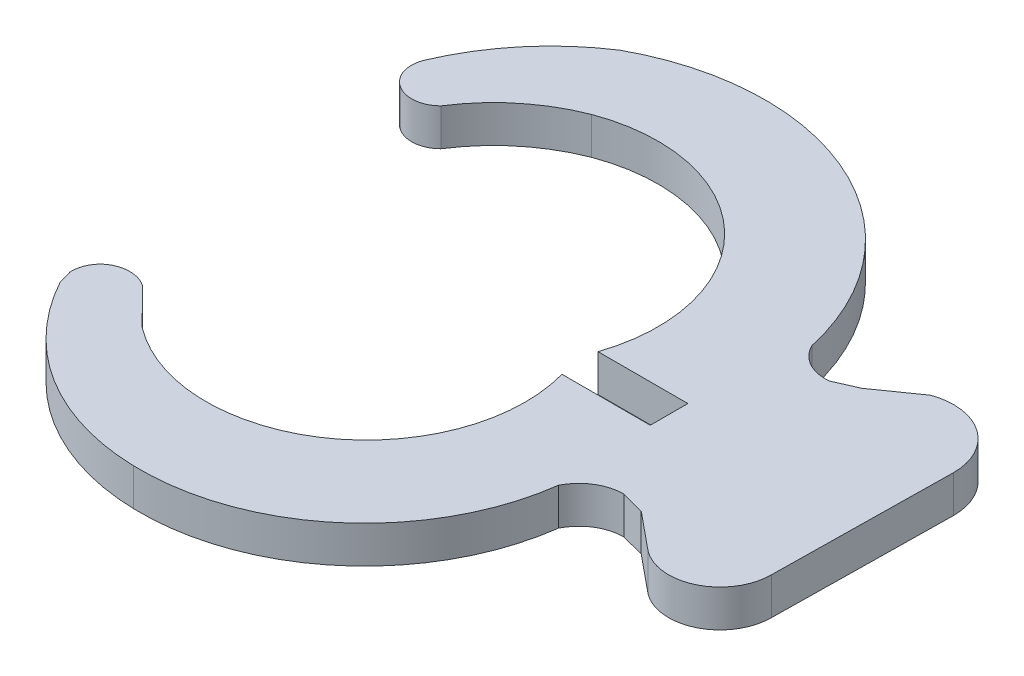
ISO-10303-21;
HEADER;
FILE_DESCRIPTION(('STEP AP214'),'2;1');
FILE_NAME('part.step','',(''),(''),'','','');
FILE_SCHEMA(('AUTOMOTIVE_DESIGN { 1 0 10303 214 1 1 1 1 }'));
ENDSEC;
DATA;
#1=APPLICATION_CONTEXT('core data for automotive mechanical design processes');
#2=APPLICATION_PROTOCOL_DEFINITION('international standard','automotive_design',2000,#1);
#3=PRODUCT_CONTEXT('',#1,'mechanical');
#4=PRODUCT('Part','Part','',(#3));
#5=PRODUCT_RELATED_PRODUCT_CATEGORY('part','',(#4));
#6=PRODUCT_DEFINITION_FORMATION('','',#4);
#7=PRODUCT_DEFINITION_CONTEXT('part definition',#1,'design');
#8=PRODUCT_DEFINITION('design','',#6,#7);
#9=PRODUCT_DEFINITION_SHAPE('','',#8);
#10=(LENGTH_UNIT() NAMED_UNIT(*) SI_UNIT(.MILLI.,.METRE.));
#11=(NAMED_UNIT(*) PLANE_ANGLE_UNIT() SI_UNIT($,.RADIAN.));
#12=(NAMED_UNIT(*) SI_UNIT($,.STERADIAN.) SOLID_ANGLE_UNIT());
#13=UNCERTAINTY_MEASURE_WITH_UNIT(LENGTH_MEASURE(1.E-05),#10,'distance_accuracy_value','');
#14=(GEOMETRIC_REPRESENTATION_CONTEXT(3) GLOBAL_UNCERTAINTY_ASSIGNED_CONTEXT((#13)) GLOBAL_UNIT_ASSIGNED_CONTEXT((#10,
#11,#12)) REPRESENTATION_CONTEXT('',''));
#15=CARTESIAN_POINT('',(0.,0.,0.));
#16=DIRECTION('',(0.,0.,1.));
#17=DIRECTION('',(1.,0.,0.));
#18=AXIS2_PLACEMENT_3D('',#15,#16,#17);
#19=CARTESIAN_POINT('',(-101.420089514844,3.,67.8808404703986));
#20=DIRECTION('',(0.,-1.,0.));
#21=DIRECTION('',(0.,0.,-1.));
#22=AXIS2_PLACEMENT_3D('',#19,#20,#21);
#23=CYLINDRICAL_SURFACE('',#22,12.9818746721);
#24=CARTESIAN_POINT('',(-101.420089514844,0.,67.8808404703986));
#25=DIRECTION('',(0.,-1.,0.));
#26=DIRECTION('',(0.,0.,1.));
#27=AXIS2_PLACEMENT_3D('',#24,#25,#26);
#28=CIRCLE('',#27,12.9818746721);
#29=CARTESIAN_POINT('',(-105.958969999949,0.,55.7182900000392));
#30=VERTEX_POINT('',#29);
#31=CARTESIAN_POINT('',(-89.12274,0.,72.0406799999823));
#32=VERTEX_POINT('',#31);
#33=EDGE_CURVE('E245',#30,#32,#28,.T.);
#34=ORIENTED_EDGE('',*,*,#33,.T.);
#35=DIRECTION('',(0.,-1.,0.));
#36=VECTOR('',#35,1.);
#37=CARTESIAN_POINT('',(-89.12274,3.,72.0406799999823));
#38=LINE('',#37,#36);
#39=CARTESIAN_POINT('',(-89.12274,3.,72.0406799999823));
#40=VERTEX_POINT('',#39);
#41=EDGE_CURVE('E11',#40,#32,#38,.T.);
#42=ORIENTED_EDGE('',*,*,#41,.F.);
#43=CARTESIAN_POINT('',(-101.420089514844,3.,67.8808404703986));
#44=DIRECTION('',(0.,-1.,0.));
#45=DIRECTION('',(0.,0.,1.));
#46=AXIS2_PLACEMENT_3D('',#43,#44,#45);
#47=CIRCLE('',#46,12.9818746721);
#48=CARTESIAN_POINT('',(-105.958969999949,3.,55.7182900000392));
#49=VERTEX_POINT('',#48);
#50=EDGE_CURVE('E297',#49,#40,#47,.T.);
#51=ORIENTED_EDGE('',*,*,#50,.F.);
#52=DIRECTION('',(0.,-1.,0.));
#53=VECTOR('',#52,1.);
#54=CARTESIAN_POINT('',(-105.958969999949,3.,55.7182900000392));
#55=LINE('',#54,#53);
#56=EDGE_CURVE('E241',#49,#30,#55,.T.);
#57=ORIENTED_EDGE('',*,*,#56,.T.);
#58=EDGE_LOOP('',(#34,#42,#51,#57));
#59=FACE_BOUND('',#58,.T.);
#60=ADVANCED_FACE('F35',(#59),#23,.F.);
#61=CARTESIAN_POINT('',(-89.12274,3.,72.0406799999823));
#62=DIRECTION('',(0.,0.,-1.));
#63=DIRECTION('',(-1.,0.,0.));
#64=AXIS2_PLACEMENT_3D('',#61,#62,#63);
#65=PLANE('',#64);
#66=DIRECTION('',(1.,0.,0.));
#67=VECTOR('',#66,1.);
#68=CARTESIAN_POINT('',(-89.12274,0.,72.0406799999823));
#69=LINE('',#68,#67);
#70=CARTESIAN_POINT('',(-81.87171,0.,72.0406799999823));
#71=VERTEX_POINT('',#70);
#72=EDGE_CURVE('E248',#32,#71,#69,.T.);
#73=ORIENTED_EDGE('',*,*,#72,.T.);
#74=DIRECTION('',(0.,-1.,0.));
#75=VECTOR('',#74,1.);
#76=CARTESIAN_POINT('',(-81.87171,3.,72.0406799999823));
#77=LINE('',#76,#75);
#78=CARTESIAN_POINT('',(-81.87171,3.,72.0406799999823));
#79=VERTEX_POINT('',#78);
#80=EDGE_CURVE('E43',#79,#71,#77,.T.);
#81=ORIENTED_EDGE('',*,*,#80,.F.);
#82=DIRECTION('',(1.,0.,0.));
#83=VECTOR('',#82,1.);
#84=CARTESIAN_POINT('',(-89.12274,3.,72.0406799999823));
#85=LINE('',#84,#83);
#86=EDGE_CURVE('E151',#40,#79,#85,.T.);
#87=ORIENTED_EDGE('',*,*,#86,.F.);
#88=ORIENTED_EDGE('',*,*,#41,.T.);
#89=EDGE_LOOP('',(#73,#81,#87,#88));
#90=FACE_BOUND('',#89,.T.);
#91=ADVANCED_FACE('F450',(#90),#65,.F.);
#92=CARTESIAN_POINT('',(-81.87171,3.,72.0406799999823));
#93=DIRECTION('',(0.999999999083245,0.,4.28194993023006E-05));
#94=DIRECTION('',(4.28194993023006E-05,0.,-0.999999999083245));
#95=AXIS2_PLACEMENT_3D('',#92,#93,#94);
#96=PLANE('',#95);
#97=DIRECTION('',(-4.28194993023006E-05,0.,0.999999999083245));
#98=VECTOR('',#97,1.);
#99=CARTESIAN_POINT('',(-81.87171,0.,72.0406799999823));
#100=LINE('',#99,#98);
#101=CARTESIAN_POINT('',(-81.87184,0.,75.0766799999823));
#102=VERTEX_POINT('',#101);
#103=EDGE_CURVE('E250',#71,#102,#100,.T.);
#104=ORIENTED_EDGE('',*,*,#103,.T.);
#105=DIRECTION('',(0.,-1.,0.));
#106=VECTOR('',#105,1.);
#107=CARTESIAN_POINT('',(-81.87184,3.,75.0766799999823));
#108=LINE('',#107,#106);
#109=CARTESIAN_POINT('',(-81.87184,3.,75.0766799999823));
#110=VERTEX_POINT('',#109);
#111=EDGE_CURVE('E361',#110,#102,#108,.T.);
#112=ORIENTED_EDGE('',*,*,#111,.F.);
#113=DIRECTION('',(-4.28194993023006E-05,0.,0.999999999083245));
#114=VECTOR('',#113,1.);
#115=CARTESIAN_POINT('',(-81.87171,3.,72.0406799999823));
#116=LINE('',#115,#114);
#117=EDGE_CURVE('E369',#79,#110,#116,.T.);
#118=ORIENTED_EDGE('',*,*,#117,.F.);
#119=ORIENTED_EDGE('',*,*,#80,.T.);
#120=EDGE_LOOP('',(#104,#112,#118,#119));
#121=FACE_BOUND('',#120,.T.);
#122=ADVANCED_FACE('F367',(#121),#96,.F.);
#123=CARTESIAN_POINT('',(-81.87184,3.,75.0766799999823));
#124=DIRECTION('',(0.,0.,1.));
#125=DIRECTION('',(1.,0.,0.));
#126=AXIS2_PLACEMENT_3D('',#123,#124,#125);
#127=PLANE('',#126);
#128=DIRECTION('',(-1.,0.,0.));
#129=VECTOR('',#128,1.);
#130=CARTESIAN_POINT('',(-81.87184,0.,75.0766799999823));
#131=LINE('',#130,#129);
#132=CARTESIAN_POINT('',(-88.9959499999828,0.,75.0766799999823));
#133=VERTEX_POINT('',#132);
#134=EDGE_CURVE('E252',#102,#133,#131,.T.);
#135=ORIENTED_EDGE('',*,*,#134,.T.);
#136=DIRECTION('',(0.,-1.,0.));
#137=VECTOR('',#136,1.);
#138=CARTESIAN_POINT('',(-88.9959499999828,3.,75.0766799999823));
#139=LINE('',#138,#137);
#140=CARTESIAN_POINT('',(-88.9959499999828,3.,75.0766799999823));
#141=VERTEX_POINT('',#140);
#142=EDGE_CURVE('E358',#141,#133,#139,.T.);
#143=ORIENTED_EDGE('',*,*,#142,.F.);
#144=DIRECTION('',(-1.,0.,0.));
#145=VECTOR('',#144,1.);
#146=CARTESIAN_POINT('',(-81.87184,3.,75.0766799999823));
#147=LINE('',#146,#145);
#148=EDGE_CURVE('E387',#110,#141,#147,.T.);
#149=ORIENTED_EDGE('',*,*,#148,.F.);
#150=ORIENTED_EDGE('',*,*,#111,.T.);
#151=EDGE_LOOP('',(#135,#143,#149,#150));
#152=FACE_BOUND('',#151,.T.);
#153=ADVANCED_FACE('F378',(#152),#127,.F.);
#154=CARTESIAN_POINT('',(-101.374730177619,3.,78.4959602925303));
#155=DIRECTION('',(0.,-1.,0.));
#156=DIRECTION('',(0.,0.,-1.));
#157=AXIS2_PLACEMENT_3D('',#154,#155,#156);
#158=CYLINDRICAL_SURFACE('',#157,12.8423392108);
#159=CARTESIAN_POINT('',(-101.374730177619,0.,78.4959602925303));
#160=DIRECTION('',(0.,-1.,0.));
#161=DIRECTION('',(0.,0.,1.));
#162=AXIS2_PLACEMENT_3D('',#159,#160,#161);
#163=CIRCLE('',#162,12.8423392108);
#164=CARTESIAN_POINT('',(-98.6930000000583,0.,91.0551799999807));
#165=VERTEX_POINT('',#164);
#166=EDGE_CURVE('E254',#133,#165,#163,.T.);
#167=ORIENTED_EDGE('',*,*,#166,.T.);
#168=DIRECTION('',(0.,-1.,0.));
#169=VECTOR('',#168,1.);
#170=CARTESIAN_POINT('',(-98.6930000000583,3.,91.0551799999807));
#171=LINE('',#170,#169);
#172=CARTESIAN_POINT('',(-98.6930000000583,3.,91.0551799999807));
#173=VERTEX_POINT('',#172);
#174=EDGE_CURVE('E355',#173,#165,#171,.T.);
#175=ORIENTED_EDGE('',*,*,#174,.F.);
#176=CARTESIAN_POINT('',(-101.374730177619,3.,78.4959602925303));
#177=DIRECTION('',(0.,-1.,0.));
#178=DIRECTION('',(0.,0.,1.));
#179=AXIS2_PLACEMENT_3D('',#176,#177,#178);
#180=CIRCLE('',#179,12.8423392108);
#181=EDGE_CURVE('E384',#141,#173,#180,.T.);
#182=ORIENTED_EDGE('',*,*,#181,.F.);
#183=ORIENTED_EDGE('',*,*,#142,.T.);
#184=EDGE_LOOP('',(#167,#175,#182,#183));
#185=FACE_BOUND('',#184,.T.);
#186=ADVANCED_FACE('F382',(#185),#158,.F.);
#187=CARTESIAN_POINT('',(-101.4515890854,3.,78.5112702025));
#188=DIRECTION('',(0.,-1.,0.));
#189=DIRECTION('',(0.,0.,-1.));
#190=AXIS2_PLACEMENT_3D('',#187,#188,#189);
#191=CYLINDRICAL_SURFACE('',#190,12.8436555057);
#192=CARTESIAN_POINT('',(-101.4515890854,0.,78.5112702025));
#193=DIRECTION('',(0.,-1.,0.));
#194=DIRECTION('',(0.,0.,1.));
#195=AXIS2_PLACEMENT_3D('',#192,#193,#194);
#196=CIRCLE('',#195,12.8436555057);
#197=CARTESIAN_POINT('',(-109.247160000021,0.,88.7185499999883));
#198=VERTEX_POINT('',#197);
#199=EDGE_CURVE('E256',#165,#198,#196,.T.);
#200=ORIENTED_EDGE('',*,*,#199,.T.);
#201=DIRECTION('',(0.,-1.,0.));
#202=VECTOR('',#201,1.);
#203=CARTESIAN_POINT('',(-109.247160000021,3.,88.7185499999883));
#204=LINE('',#203,#202);
#205=CARTESIAN_POINT('',(-109.247160000021,3.,88.7185499999883));
#206=VERTEX_POINT('',#205);
#207=EDGE_CURVE('E352',#206,#198,#204,.T.);
#208=ORIENTED_EDGE('',*,*,#207,.F.);
#209=CARTESIAN_POINT('',(-101.4515890854,3.,78.5112702025));
#210=DIRECTION('',(0.,-1.,0.));
#211=DIRECTION('',(0.,0.,1.));
#212=AXIS2_PLACEMENT_3D('',#209,#210,#211);
#213=CIRCLE('',#212,12.8436555057);
#214=EDGE_CURVE('E386',#173,#206,#213,.T.);
#215=ORIENTED_EDGE('',*,*,#214,.F.);
#216=ORIENTED_EDGE('',*,*,#174,.T.);
#217=EDGE_LOOP('',(#200,#208,#215,#216));
#218=FACE_BOUND('',#217,.T.);
#219=ADVANCED_FACE('F463',(#218),#191,.F.);
#220=CARTESIAN_POINT('',(-109.247160000021,3.,88.7185499999883));
#221=DIRECTION('',(-0.712944107192267,0.,0.701220863936479));
#222=DIRECTION('',(0.701220863936479,0.,0.712944107192267));
#223=AXIS2_PLACEMENT_3D('',#220,#221,#222);
#224=PLANE('',#223);
#225=DIRECTION('',(-0.701220863936479,0.,-0.712944107192267));
#226=VECTOR('',#225,1.);
#227=CARTESIAN_POINT('',(-109.247160000021,0.,88.7185499999883));
#228=LINE('',#227,#226);
#229=CARTESIAN_POINT('',(-112.06981,0.,85.84871));
#230=VERTEX_POINT('',#229);
#231=EDGE_CURVE('E258',#198,#230,#228,.T.);
#232=ORIENTED_EDGE('',*,*,#231,.T.);
#233=DIRECTION('',(0.,-1.,0.));
#234=VECTOR('',#233,1.);
#235=CARTESIAN_POINT('',(-112.06981,3.,85.84871));
#236=LINE('',#235,#234);
#237=CARTESIAN_POINT('',(-112.06981,3.,85.84871));
#238=VERTEX_POINT('',#237);
#239=EDGE_CURVE('E349',#238,#230,#236,.T.);
#240=ORIENTED_EDGE('',*,*,#239,.F.);
#241=DIRECTION('',(-0.701220863936479,0.,-0.712944107192267));
#242=VECTOR('',#241,1.);
#243=CARTESIAN_POINT('',(-109.247160000021,3.,88.7185499999883));
#244=LINE('',#243,#242);
#245=EDGE_CURVE('E389',#206,#238,#244,.T.);
#246=ORIENTED_EDGE('',*,*,#245,.F.);
#247=ORIENTED_EDGE('',*,*,#207,.T.);
#248=EDGE_LOOP('',(#232,#240,#246,#247));
#249=FACE_BOUND('',#248,.T.);
#250=ADVANCED_FACE('F466',(#249),#224,.F.);
#251=CARTESIAN_POINT('',(-113.617264390402,3.,87.9010598602011));
#252=DIRECTION('',(0.,-1.,0.));
#253=DIRECTION('',(0.,0.,-1.));
#254=AXIS2_PLACEMENT_3D('',#251,#252,#253);
#255=CYLINDRICAL_SURFACE('',#254,2.57036087720001);
#256=CARTESIAN_POINT('',(-113.617264390402,0.,87.9010598602011));
#257=DIRECTION('',(0.,1.,0.));
#258=DIRECTION('',(0.,0.,1.));
#259=AXIS2_PLACEMENT_3D('',#256,#257,#258);
#260=CIRCLE('',#259,2.57036087720001);
#261=CARTESIAN_POINT('',(-115.030969999961,0.,85.754390000036));
#262=VERTEX_POINT('',#261);
#263=EDGE_CURVE('E260',#230,#262,#260,.T.);
#264=ORIENTED_EDGE('',*,*,#263,.T.);
#265=DIRECTION('',(0.,-1.,0.));
#266=VECTOR('',#265,1.);
#267=CARTESIAN_POINT('',(-115.030969999961,3.,85.754390000036));
#268=LINE('',#267,#266);
#269=CARTESIAN_POINT('',(-115.030969999961,3.,85.754390000036));
#270=VERTEX_POINT('',#269);
#271=EDGE_CURVE('E346',#270,#262,#268,.T.);
#272=ORIENTED_EDGE('',*,*,#271,.F.);
#273=CARTESIAN_POINT('',(-113.617264390402,3.,87.9010598602011));
#274=DIRECTION('',(0.,1.,0.));
#275=DIRECTION('',(0.,0.,1.));
#276=AXIS2_PLACEMENT_3D('',#273,#274,#275);
#277=CIRCLE('',#276,2.57036087720001);
#278=EDGE_CURVE('E395',#238,#270,#277,.T.);
#279=ORIENTED_EDGE('',*,*,#278,.F.);
#280=ORIENTED_EDGE('',*,*,#239,.T.);
#281=EDGE_LOOP('',(#264,#272,#279,#280));
#282=FACE_BOUND('',#281,.T.);
#283=ADVANCED_FACE('F470',(#282),#255,.T.);
#284=CARTESIAN_POINT('',(-113.655320212299,3.,87.6603504400306));
#285=DIRECTION('',(0.,-1.,0.));
#286=DIRECTION('',(0.,0.,-1.));
#287=AXIS2_PLACEMENT_3D('',#284,#285,#286);
#288=CYLINDRICAL_SURFACE('',#287,2.3505526025);
#289=CARTESIAN_POINT('',(-113.655320212299,0.,87.6603504400306));
#290=DIRECTION('',(0.,1.,0.));
#291=DIRECTION('',(0.,0.,1.));
#292=AXIS2_PLACEMENT_3D('',#289,#290,#291);
#293=CIRCLE('',#292,2.3505526025);
#294=CARTESIAN_POINT('',(-116.003320000011,0.,87.7698700000254));
#295=VERTEX_POINT('',#294);
#296=EDGE_CURVE('E262',#262,#295,#293,.T.);
#297=ORIENTED_EDGE('',*,*,#296,.T.);
#298=DIRECTION('',(0.,-1.,0.));
#299=VECTOR('',#298,1.);
#300=CARTESIAN_POINT('',(-116.003320000011,3.,87.7698700000254));
#301=LINE('',#300,#299);
#302=CARTESIAN_POINT('',(-116.003320000011,3.,87.7698700000254));
#303=VERTEX_POINT('',#302);
#304=EDGE_CURVE('E343',#303,#295,#301,.T.);
#305=ORIENTED_EDGE('',*,*,#304,.F.);
#306=CARTESIAN_POINT('',(-113.655320212299,3.,87.6603504400306));
#307=DIRECTION('',(0.,1.,0.));
#308=DIRECTION('',(0.,0.,1.));
#309=AXIS2_PLACEMENT_3D('',#306,#307,#308);
#310=CIRCLE('',#309,2.3505526025);
#311=EDGE_CURVE('E397',#270,#303,#310,.T.);
#312=ORIENTED_EDGE('',*,*,#311,.F.);
#313=ORIENTED_EDGE('',*,*,#271,.T.);
#314=EDGE_LOOP('',(#297,#305,#312,#313));
#315=FACE_BOUND('',#314,.T.);
#316=ADVANCED_FACE('F474',(#315),#288,.T.);
#317=CARTESIAN_POINT('',(-116.003320000011,3.,87.7698700000254));
#318=DIRECTION('',(0.963858796061371,0.,-0.266413628133256));
#319=DIRECTION('',(-0.266413628133256,0.,-0.963858796061371));
#320=AXIS2_PLACEMENT_3D('',#317,#318,#319);
#321=PLANE('',#320);
#322=DIRECTION('',(0.266413628133256,0.,0.963858796061371));
#323=VECTOR('',#322,1.);
#324=CARTESIAN_POINT('',(-116.003320000011,0.,87.7698700000254));
#325=LINE('',#324,#323);
#326=CARTESIAN_POINT('',(-115.70282,0.,88.85705));
#327=VERTEX_POINT('',#326);
#328=EDGE_CURVE('E264',#295,#327,#325,.T.);
#329=ORIENTED_EDGE('',*,*,#328,.T.);
#330=DIRECTION('',(0.,-1.,0.));
#331=VECTOR('',#330,1.);
#332=CARTESIAN_POINT('',(-115.70282,3.,88.85705));
#333=LINE('',#332,#331);
#334=CARTESIAN_POINT('',(-115.70282,3.,88.85705));
#335=VERTEX_POINT('',#334);
#336=EDGE_CURVE('E340',#335,#327,#333,.T.);
#337=ORIENTED_EDGE('',*,*,#336,.F.);
#338=DIRECTION('',(0.266413628133256,0.,0.963858796061371));
#339=VECTOR('',#338,1.);
#340=CARTESIAN_POINT('',(-116.003320000011,3.,87.7698700000254));
#341=LINE('',#340,#339);
#342=EDGE_CURVE('E399',#303,#335,#341,.T.);
#343=ORIENTED_EDGE('',*,*,#342,.F.);
#344=ORIENTED_EDGE('',*,*,#304,.T.);
#345=EDGE_LOOP('',(#329,#337,#343,#344));
#346=FACE_BOUND('',#345,.T.);
#347=ADVANCED_FACE('F478',(#346),#321,.F.);
#348=CARTESIAN_POINT('',(-98.2844623909007,3.,79.4113268059982));
#349=DIRECTION('',(0.,-1.,0.));
#350=DIRECTION('',(0.,0.,-1.));
#351=AXIS2_PLACEMENT_3D('',#348,#349,#350);
#352=CYLINDRICAL_SURFACE('',#351,19.814662966);
#353=CARTESIAN_POINT('',(-98.2844623909007,0.,79.4113268059982));
#354=DIRECTION('',(0.,1.,0.));
#355=DIRECTION('',(0.,0.,1.));
#356=AXIS2_PLACEMENT_3D('',#353,#354,#355);
#357=CIRCLE('',#356,19.814662966);
#358=CARTESIAN_POINT('',(-112.255470000065,0.,93.4623700000407));
#359=VERTEX_POINT('',#358);
#360=EDGE_CURVE('E266',#327,#359,#357,.T.);
#361=ORIENTED_EDGE('',*,*,#360,.T.);
#362=DIRECTION('',(0.,-1.,0.));
#363=VECTOR('',#362,1.);
#364=CARTESIAN_POINT('',(-112.255470000065,3.,93.4623700000407));
#365=LINE('',#364,#363);
#366=CARTESIAN_POINT('',(-112.255470000065,3.,93.4623700000407));
#367=VERTEX_POINT('',#366);
#368=EDGE_CURVE('E337',#367,#359,#365,.T.);
#369=ORIENTED_EDGE('',*,*,#368,.F.);
#370=CARTESIAN_POINT('',(-98.2844623909007,3.,79.4113268059982));
#371=DIRECTION('',(0.,1.,0.));
#372=DIRECTION('',(0.,0.,1.));
#373=AXIS2_PLACEMENT_3D('',#370,#371,#372);
#374=CIRCLE('',#373,19.814662966);
#375=EDGE_CURVE('E401',#335,#367,#374,.T.);
#376=ORIENTED_EDGE('',*,*,#375,.F.);
#377=ORIENTED_EDGE('',*,*,#336,.T.);
#378=EDGE_LOOP('',(#361,#369,#376,#377));
#379=FACE_BOUND('',#378,.T.);
#380=ADVANCED_FACE('F482',(#379),#352,.T.);
#381=CARTESIAN_POINT('',(-99.4489190593656,3.,80.6509504032959));
#382=DIRECTION('',(0.,-1.,0.));
#383=DIRECTION('',(0.,0.,-1.));
#384=AXIS2_PLACEMENT_3D('',#381,#382,#383);
#385=CYLINDRICAL_SURFACE('',#384,18.1146410144);
#386=CARTESIAN_POINT('',(-99.4489190593656,0.,80.6509504032959));
#387=DIRECTION('',(0.,1.,0.));
#388=DIRECTION('',(0.,0.,1.));
#389=AXIS2_PLACEMENT_3D('',#386,#387,#388);
#390=CIRCLE('',#389,18.1146410144);
#391=CARTESIAN_POINT('',(-99.8981599999557,0.,98.7600199999892));
#392=VERTEX_POINT('',#391);
#393=EDGE_CURVE('E268',#359,#392,#390,.T.);
#394=ORIENTED_EDGE('',*,*,#393,.T.);
#395=DIRECTION('',(0.,-1.,0.));
#396=VECTOR('',#395,1.);
#397=CARTESIAN_POINT('',(-99.8981599999557,3.,98.7600199999892));
#398=LINE('',#397,#396);
#399=CARTESIAN_POINT('',(-99.8981599999557,3.,98.7600199999892));
#400=VERTEX_POINT('',#399);
#401=EDGE_CURVE('E334',#400,#392,#398,.T.);
#402=ORIENTED_EDGE('',*,*,#401,.F.);
#403=CARTESIAN_POINT('',(-99.4489190593656,3.,80.6509504032959));
#404=DIRECTION('',(0.,1.,0.));
#405=DIRECTION('',(0.,0.,1.));
#406=AXIS2_PLACEMENT_3D('',#403,#404,#405);
#407=CIRCLE('',#406,18.1146410144);
#408=EDGE_CURVE('E403',#367,#400,#407,.T.);
#409=ORIENTED_EDGE('',*,*,#408,.F.);
#410=ORIENTED_EDGE('',*,*,#368,.T.);
#411=EDGE_LOOP('',(#394,#402,#409,#410));
#412=FACE_BOUND('',#411,.T.);
#413=ADVANCED_FACE('F486',(#412),#385,.T.);
#414=CARTESIAN_POINT('',(-99.3746163306874,3.,80.6251268721036));
#415=DIRECTION('',(0.,-1.,0.));
#416=DIRECTION('',(0.,0.,-1.));
#417=AXIS2_PLACEMENT_3D('',#414,#415,#416);
#418=CYLINDRICAL_SURFACE('',#417,18.1424487524);
#419=CARTESIAN_POINT('',(-99.3746163306874,0.,80.6251268721036));
#420=DIRECTION('',(0.,1.,0.));
#421=DIRECTION('',(0.,0.,1.));
#422=AXIS2_PLACEMENT_3D('',#419,#420,#421);
#423=CIRCLE('',#422,18.1424487524);
#424=CARTESIAN_POINT('',(-81.3855199999167,0.,82.9790300000413));
#425=VERTEX_POINT('',#424);
#426=EDGE_CURVE('E270',#392,#425,#423,.T.);
#427=ORIENTED_EDGE('',*,*,#426,.T.);
#428=DIRECTION('',(0.,-1.,0.));
#429=VECTOR('',#428,1.);
#430=CARTESIAN_POINT('',(-81.3855199999167,3.,82.9790300000413));
#431=LINE('',#430,#429);
#432=CARTESIAN_POINT('',(-81.3855199999167,3.,82.9790300000413));
#433=VERTEX_POINT('',#432);
#434=EDGE_CURVE('E331',#433,#425,#431,.T.);
#435=ORIENTED_EDGE('',*,*,#434,.F.);
#436=CARTESIAN_POINT('',(-99.3746163306874,3.,80.6251268721036));
#437=DIRECTION('',(0.,1.,0.));
#438=DIRECTION('',(0.,0.,1.));
#439=AXIS2_PLACEMENT_3D('',#436,#437,#438);
#440=CIRCLE('',#439,18.1424487524);
#441=EDGE_CURVE('E405',#400,#433,#440,.T.);
#442=ORIENTED_EDGE('',*,*,#441,.F.);
#443=ORIENTED_EDGE('',*,*,#401,.T.);
#444=EDGE_LOOP('',(#427,#435,#442,#443));
#445=FACE_BOUND('',#444,.T.);
#446=ADVANCED_FACE('F490',(#445),#418,.T.);
#447=CARTESIAN_POINT('',(-78.1060300534613,3.,84.6018900336192));
#448=DIRECTION('',(0.,-1.,0.));
#449=DIRECTION('',(0.,0.,-1.));
#450=AXIS2_PLACEMENT_3D('',#447,#448,#449);
#451=CYLINDRICAL_SURFACE('',#450,3.65906121805675);
#452=CARTESIAN_POINT('',(-78.1060300534613,0.,84.6018900336192));
#453=DIRECTION('',(0.,-1.,0.));
#454=DIRECTION('',(0.,0.,1.));
#455=AXIS2_PLACEMENT_3D('',#452,#453,#454);
#456=CIRCLE('',#455,3.65906121805675);
#457=CARTESIAN_POINT('',(-78.1444000000126,0.,80.9430300001267));
#458=VERTEX_POINT('',#457);
#459=EDGE_CURVE('E272',#425,#458,#456,.T.);
#460=ORIENTED_EDGE('',*,*,#459,.T.);
#461=DIRECTION('',(0.,-1.,0.));
#462=VECTOR('',#461,1.);
#463=CARTESIAN_POINT('',(-78.1444000000126,3.,80.9430300001267));
#464=LINE('',#463,#462);
#465=CARTESIAN_POINT('',(-78.1444000000126,3.,80.9430300001267));
#466=VERTEX_POINT('',#465);
#467=EDGE_CURVE('E328',#466,#458,#464,.T.);
#468=ORIENTED_EDGE('',*,*,#467,.F.);
#469=CARTESIAN_POINT('',(-78.1060300534613,3.,84.6018900336192));
#470=DIRECTION('',(0.,-1.,0.));
#471=DIRECTION('',(0.,0.,1.));
#472=AXIS2_PLACEMENT_3D('',#469,#470,#471);
#473=CIRCLE('',#472,3.65906121805675);
#474=EDGE_CURVE('E407',#433,#466,#473,.T.);
#475=ORIENTED_EDGE('',*,*,#474,.F.);
#476=ORIENTED_EDGE('',*,*,#434,.T.);
#477=EDGE_LOOP('',(#460,#468,#475,#476));
#478=FACE_BOUND('',#477,.T.);
#479=ADVANCED_FACE('F494',(#478),#451,.F.);
#480=CARTESIAN_POINT('',(-78.1444000000126,3.,80.9430300001267));
#481=DIRECTION('',(0.256443620524888,0.,-0.966559190889046));
#482=DIRECTION('',(-0.966559190889046,0.,-0.256443620524888));
#483=AXIS2_PLACEMENT_3D('',#480,#481,#482);
#484=PLANE('',#483);
#485=DIRECTION('',(0.966559190889046,0.,0.256443620524888));
#486=VECTOR('',#485,1.);
#487=CARTESIAN_POINT('',(-78.1444000000126,0.,80.9430300001267));
#488=LINE('',#487,#486);
#489=CARTESIAN_POINT('',(-76.2233699999608,0.,81.4527100000624));
#490=VERTEX_POINT('',#489);
#491=EDGE_CURVE('E274',#458,#490,#488,.T.);
#492=ORIENTED_EDGE('',*,*,#491,.T.);
#493=DIRECTION('',(0.,-1.,0.));
#494=VECTOR('',#493,1.);
#495=CARTESIAN_POINT('',(-76.2233699999608,3.,81.4527100000624));
#496=LINE('',#495,#494);
#497=CARTESIAN_POINT('',(-76.2233699999608,3.,81.4527100000624));
#498=VERTEX_POINT('',#497);
#499=EDGE_CURVE('E325',#498,#490,#496,.T.);
#500=ORIENTED_EDGE('',*,*,#499,.F.);
#501=DIRECTION('',(0.966559190889046,0.,0.256443620524888));
#502=VECTOR('',#501,1.);
#503=CARTESIAN_POINT('',(-78.1444000000126,3.,80.9430300001267));
#504=LINE('',#503,#502);
#505=EDGE_CURVE('E409',#466,#498,#504,.T.);
#506=ORIENTED_EDGE('',*,*,#505,.F.);
#507=ORIENTED_EDGE('',*,*,#467,.T.);
#508=EDGE_LOOP('',(#492,#500,#506,#507));
#509=FACE_BOUND('',#508,.T.);
#510=ADVANCED_FACE('F498',(#509),#484,.F.);
#511=CARTESIAN_POINT('',(-76.2233699999608,3.,81.4527100000624));
#512=DIRECTION('',(0.634039513264893,0.,-0.773300650212333));
#513=DIRECTION('',(-0.773300650212333,0.,-0.634039513264893));
#514=AXIS2_PLACEMENT_3D('',#511,#512,#513);
#515=PLANE('',#514);
#516=DIRECTION('',(0.773300650212333,0.,0.634039513264893));
#517=VECTOR('',#516,1.);
#518=CARTESIAN_POINT('',(-76.2233699999608,0.,81.4527100000624));
#519=LINE('',#518,#517);
#520=CARTESIAN_POINT('',(-73.1472399999608,0.,83.9748700000624));
#521=VERTEX_POINT('',#520);
#522=EDGE_CURVE('E276',#490,#521,#519,.T.);
#523=ORIENTED_EDGE('',*,*,#522,.T.);
#524=DIRECTION('',(0.,-1.,0.));
#525=VECTOR('',#524,1.);
#526=CARTESIAN_POINT('',(-73.1472399999608,3.,83.9748700000624));
#527=LINE('',#526,#525);
#528=CARTESIAN_POINT('',(-73.1472399999608,3.,83.9748700000624));
#529=VERTEX_POINT('',#528);
#530=EDGE_CURVE('E322',#529,#521,#527,.T.);
#531=ORIENTED_EDGE('',*,*,#530,.F.);
#532=DIRECTION('',(0.773300650212333,0.,0.634039513264893));
#533=VECTOR('',#532,1.);
#534=CARTESIAN_POINT('',(-76.2233699999608,3.,81.4527100000624));
#535=LINE('',#534,#533);
#536=EDGE_CURVE('E411',#498,#529,#535,.T.);
#537=ORIENTED_EDGE('',*,*,#536,.F.);
#538=ORIENTED_EDGE('',*,*,#499,.T.);
#539=EDGE_LOOP('',(#523,#531,#537,#538));
#540=FACE_BOUND('',#539,.T.);
#541=ADVANCED_FACE('F502',(#540),#515,.F.);
#542=CARTESIAN_POINT('',(-70.6789946506021,3.,80.6392923584506));
#543=DIRECTION('',(0.,-1.,0.));
#544=DIRECTION('',(0.,0.,-1.));
#545=AXIS2_PLACEMENT_3D('',#542,#543,#544);
#546=CYLINDRICAL_SURFACE('',#545,4.14949554859999);
#547=CARTESIAN_POINT('',(-70.6789946506021,0.,80.6392923584506));
#548=DIRECTION('',(0.,1.,0.));
#549=DIRECTION('',(0.,0.,1.));
#550=AXIS2_PLACEMENT_3D('',#547,#548,#549);
#551=CIRCLE('',#550,4.14949554859999);
#552=CARTESIAN_POINT('',(-66.5295499999998,0.,80.6187399999702));
#553=VERTEX_POINT('',#552);
#554=EDGE_CURVE('E278',#521,#553,#551,.T.);
#555=ORIENTED_EDGE('',*,*,#554,.T.);
#556=DIRECTION('',(0.,-1.,0.));
#557=VECTOR('',#556,1.);
#558=CARTESIAN_POINT('',(-66.5295499999998,3.,80.6187399999702));
#559=LINE('',#558,#557);
#560=CARTESIAN_POINT('',(-66.5295499999998,3.,80.6187399999702));
#561=VERTEX_POINT('',#560);
#562=EDGE_CURVE('E319',#561,#553,#559,.T.);
#563=ORIENTED_EDGE('',*,*,#562,.F.);
#564=CARTESIAN_POINT('',(-70.6789946506021,3.,80.6392923584506));
#565=DIRECTION('',(0.,1.,0.));
#566=DIRECTION('',(0.,0.,1.));
#567=AXIS2_PLACEMENT_3D('',#564,#565,#566);
#568=CIRCLE('',#567,4.14949554859999);
#569=EDGE_CURVE('E413',#529,#561,#568,.T.);
#570=ORIENTED_EDGE('',*,*,#569,.F.);
#571=ORIENTED_EDGE('',*,*,#530,.T.);
#572=EDGE_LOOP('',(#555,#563,#570,#571));
#573=FACE_BOUND('',#572,.T.);
#574=ADVANCED_FACE('F506',(#573),#546,.T.);
#575=CARTESIAN_POINT('',(-66.5295499999998,3.,80.6187399999702));
#576=DIRECTION('',(-0.999895628397086,0.,-0.0144475711590884));
#577=DIRECTION('',(-0.0144475711590884,0.,0.999895628397086));
#578=AXIS2_PLACEMENT_3D('',#575,#576,#577);
#579=PLANE('',#578);
#580=DIRECTION('',(0.0144475711590884,0.,-0.999895628397086));
#581=VECTOR('',#580,1.);
#582=CARTESIAN_POINT('',(-66.5295499999998,0.,80.6187399999702));
#583=LINE('',#582,#581);
#584=CARTESIAN_POINT('',(-66.320260000002,0.,66.1340799999799));
#585=VERTEX_POINT('',#584);
#586=EDGE_CURVE('E280',#553,#585,#583,.T.);
#587=ORIENTED_EDGE('',*,*,#586,.T.);
#588=DIRECTION('',(0.,-1.,0.));
#589=VECTOR('',#588,1.);
#590=CARTESIAN_POINT('',(-66.320260000002,3.,66.1340799999799));
#591=LINE('',#590,#589);
#592=CARTESIAN_POINT('',(-66.320260000002,3.,66.1340799999799));
#593=VERTEX_POINT('',#592);
#594=EDGE_CURVE('E316',#593,#585,#591,.T.);
#595=ORIENTED_EDGE('',*,*,#594,.F.);
#596=DIRECTION('',(0.0144475711590884,0.,-0.999895628397086));
#597=VECTOR('',#596,1.);
#598=CARTESIAN_POINT('',(-66.5295499999998,3.,80.6187399999702));
#599=LINE('',#598,#597);
#600=EDGE_CURVE('E415',#561,#593,#599,.T.);
#601=ORIENTED_EDGE('',*,*,#600,.F.);
#602=ORIENTED_EDGE('',*,*,#562,.T.);
#603=EDGE_LOOP('',(#587,#595,#601,#602));
#604=FACE_BOUND('',#603,.T.);
#605=ADVANCED_FACE('F510',(#604),#579,.F.);
#606=CARTESIAN_POINT('',(-71.0619027663389,3.,66.1311150957931));
#607=DIRECTION('',(0.,-1.,0.));
#608=DIRECTION('',(0.,0.,-1.));
#609=AXIS2_PLACEMENT_3D('',#606,#607,#608);
#610=CYLINDRICAL_SURFACE('',#609,4.74164369330002);
#611=CARTESIAN_POINT('',(-71.0619027663389,0.,66.1311150957931));
#612=DIRECTION('',(0.,1.,0.));
#613=DIRECTION('',(0.,0.,1.));
#614=AXIS2_PLACEMENT_3D('',#611,#612,#613);
#615=CIRCLE('',#614,4.74164369330002);
#616=CARTESIAN_POINT('',(-72.6610499999597,0.,61.66726999998));
#617=VERTEX_POINT('',#616);
#618=EDGE_CURVE('E282',#585,#617,#615,.T.);
#619=ORIENTED_EDGE('',*,*,#618,.T.);
#620=DIRECTION('',(0.,-1.,0.));
#621=VECTOR('',#620,1.);
#622=CARTESIAN_POINT('',(-72.6610499999597,3.,61.66726999998));
#623=LINE('',#622,#621);
#624=CARTESIAN_POINT('',(-72.6610499999597,3.,61.66726999998));
#625=VERTEX_POINT('',#624);
#626=EDGE_CURVE('E313',#625,#617,#623,.T.);
#627=ORIENTED_EDGE('',*,*,#626,.F.);
#628=CARTESIAN_POINT('',(-71.0619027663389,3.,66.1311150957931));
#629=DIRECTION('',(0.,1.,0.));
#630=DIRECTION('',(0.,0.,1.));
#631=AXIS2_PLACEMENT_3D('',#628,#629,#630);
#632=CIRCLE('',#631,4.74164369330002);
#633=EDGE_CURVE('E417',#593,#625,#632,.T.);
#634=ORIENTED_EDGE('',*,*,#633,.F.);
#635=ORIENTED_EDGE('',*,*,#594,.T.);
#636=EDGE_LOOP('',(#619,#627,#634,#635));
#637=FACE_BOUND('',#636,.T.);
#638=ADVANCED_FACE('F514',(#637),#610,.T.);
#639=CARTESIAN_POINT('',(-72.6610499999597,3.,61.66726999998));
#640=DIRECTION('',(0.574520699468639,0.,0.818490052402633));
#641=DIRECTION('',(0.818490052402633,0.,-0.574520699468639));
#642=AXIS2_PLACEMENT_3D('',#639,#640,#641);
#643=PLANE('',#642);
#644=DIRECTION('',(-0.818490052402634,0.,0.574520699468639));
#645=VECTOR('',#644,1.);
#646=CARTESIAN_POINT('',(-72.6610499999597,0.,61.66726999998));
#647=LINE('',#646,#645);
#648=CARTESIAN_POINT('',(-75.922740000002,0.,63.9567399999799));
#649=VERTEX_POINT('',#648);
#650=EDGE_CURVE('E284',#617,#649,#647,.T.);
#651=ORIENTED_EDGE('',*,*,#650,.T.);
#652=DIRECTION('',(0.,-1.,0.));
#653=VECTOR('',#652,1.);
#654=CARTESIAN_POINT('',(-75.922740000002,3.,63.9567399999799));
#655=LINE('',#654,#653);
#656=CARTESIAN_POINT('',(-75.922740000002,3.,63.9567399999799));
#657=VERTEX_POINT('',#656);
#658=EDGE_CURVE('E310',#657,#649,#655,.T.);
#659=ORIENTED_EDGE('',*,*,#658,.F.);
#660=DIRECTION('',(-0.818490052402634,0.,0.574520699468639));
#661=VECTOR('',#660,1.);
#662=CARTESIAN_POINT('',(-72.6610499999597,3.,61.66726999998));
#663=LINE('',#662,#661);
#664=EDGE_CURVE('E419',#625,#657,#663,.T.);
#665=ORIENTED_EDGE('',*,*,#664,.F.);
#666=ORIENTED_EDGE('',*,*,#626,.T.);
#667=EDGE_LOOP('',(#651,#659,#665,#666));
#668=FACE_BOUND('',#667,.T.);
#669=ADVANCED_FACE('F518',(#668),#643,.F.);
#670=CARTESIAN_POINT('',(-75.922740000002,3.,63.9567399999799));
#671=DIRECTION('',(0.403662697717394,0.,0.914907878680425));
#672=DIRECTION('',(0.914907878680425,0.,-0.403662697717394));
#673=AXIS2_PLACEMENT_3D('',#670,#671,#672);
#674=PLANE('',#673);
#675=DIRECTION('',(-0.914907878680425,0.,0.403662697717394));
#676=VECTOR('',#675,1.);
#677=CARTESIAN_POINT('',(-75.922740000002,0.,63.9567399999799));
#678=LINE('',#677,#676);
#679=CARTESIAN_POINT('',(-77.7054000000357,0.,64.7432599999654));
#680=VERTEX_POINT('',#679);
#681=EDGE_CURVE('E286',#649,#680,#678,.T.);
#682=ORIENTED_EDGE('',*,*,#681,.T.);
#683=DIRECTION('',(0.,-1.,0.));
#684=VECTOR('',#683,1.);
#685=CARTESIAN_POINT('',(-77.7054000000357,3.,64.7432599999654));
#686=LINE('',#685,#684);
#687=CARTESIAN_POINT('',(-77.7054000000357,3.,64.7432599999654));
#688=VERTEX_POINT('',#687);
#689=EDGE_CURVE('E307',#688,#680,#686,.T.);
#690=ORIENTED_EDGE('',*,*,#689,.F.);
#691=DIRECTION('',(-0.914907878680425,0.,0.403662697717394));
#692=VECTOR('',#691,1.);
#693=CARTESIAN_POINT('',(-75.922740000002,3.,63.9567399999799));
#694=LINE('',#693,#692);
#695=EDGE_CURVE('E421',#657,#688,#694,.T.);
#696=ORIENTED_EDGE('',*,*,#695,.F.);
#697=ORIENTED_EDGE('',*,*,#658,.T.);
#698=EDGE_LOOP('',(#682,#690,#696,#697));
#699=FACE_BOUND('',#698,.T.);
#700=ADVANCED_FACE('F522',(#699),#674,.F.);
#701=CARTESIAN_POINT('',(-78.086549572402,3.,61.6339102364799));
#702=DIRECTION('',(0.,-1.,0.));
#703=DIRECTION('',(0.,0.,-1.));
#704=AXIS2_PLACEMENT_3D('',#701,#702,#703);
#705=CYLINDRICAL_SURFACE('',#704,3.1326236525);
#706=CARTESIAN_POINT('',(-78.086549572402,0.,61.6339102364799));
#707=DIRECTION('',(0.,-1.,0.));
#708=DIRECTION('',(0.,0.,1.));
#709=AXIS2_PLACEMENT_3D('',#706,#707,#708);
#710=CIRCLE('',#709,3.1326236525);
#711=CARTESIAN_POINT('',(-80.9229000000382,0.,62.9637399999648));
#712=VERTEX_POINT('',#711);
#713=EDGE_CURVE('E288',#680,#712,#710,.T.);
#714=ORIENTED_EDGE('',*,*,#713,.T.);
#715=DIRECTION('',(0.,-1.,0.));
#716=VECTOR('',#715,1.);
#717=CARTESIAN_POINT('',(-80.9229000000382,3.,62.9637399999648));
#718=LINE('',#717,#716);
#719=CARTESIAN_POINT('',(-80.9229000000382,3.,62.9637399999648));
#720=VERTEX_POINT('',#719);
#721=EDGE_CURVE('E304',#720,#712,#718,.T.);
#722=ORIENTED_EDGE('',*,*,#721,.F.);
#723=CARTESIAN_POINT('',(-78.086549572402,3.,61.6339102364799));
#724=DIRECTION('',(0.,-1.,0.));
#725=DIRECTION('',(0.,0.,1.));
#726=AXIS2_PLACEMENT_3D('',#723,#724,#725);
#727=CIRCLE('',#726,3.1326236525);
#728=EDGE_CURVE('E423',#688,#720,#727,.T.);
#729=ORIENTED_EDGE('',*,*,#728,.F.);
#730=ORIENTED_EDGE('',*,*,#689,.T.);
#731=EDGE_LOOP('',(#714,#722,#729,#730));
#732=FACE_BOUND('',#731,.T.);
#733=ADVANCED_FACE('F526',(#732),#705,.F.);
#734=CARTESIAN_POINT('',(-99.95632421029,3.,67.1897880867733));
#735=DIRECTION('',(0.,-1.,0.));
#736=DIRECTION('',(0.,0.,-1.));
#737=AXIS2_PLACEMENT_3D('',#734,#735,#736);
#738=CYLINDRICAL_SURFACE('',#737,19.4969412883);
#739=CARTESIAN_POINT('',(-99.95632421029,0.,67.1897880867733));
#740=DIRECTION('',(0.,1.,0.));
#741=DIRECTION('',(0.,0.,1.));
#742=AXIS2_PLACEMENT_3D('',#739,#740,#741);
#743=CIRCLE('',#742,19.4969412883);
#744=CARTESIAN_POINT('',(-109.291450000006,0.,50.0729499999769));
#745=VERTEX_POINT('',#744);
#746=EDGE_CURVE('E290',#712,#745,#743,.T.);
#747=ORIENTED_EDGE('',*,*,#746,.T.);
#748=DIRECTION('',(0.,-1.,0.));
#749=VECTOR('',#748,1.);
#750=CARTESIAN_POINT('',(-109.291450000006,3.,50.0729499999769));
#751=LINE('',#750,#749);
#752=CARTESIAN_POINT('',(-109.291450000006,3.,50.0729499999769));
#753=VERTEX_POINT('',#752);
#754=EDGE_CURVE('E301',#753,#745,#751,.T.);
#755=ORIENTED_EDGE('',*,*,#754,.F.);
#756=CARTESIAN_POINT('',(-99.95632421029,3.,67.1897880867733));
#757=DIRECTION('',(0.,1.,0.));
#758=DIRECTION('',(0.,0.,1.));
#759=AXIS2_PLACEMENT_3D('',#756,#757,#758);
#760=CIRCLE('',#759,19.4969412883);
#761=EDGE_CURVE('E425',#720,#753,#760,.T.);
#762=ORIENTED_EDGE('',*,*,#761,.F.);
#763=ORIENTED_EDGE('',*,*,#721,.T.);
#764=EDGE_LOOP('',(#747,#755,#762,#763));
#765=FACE_BOUND('',#764,.T.);
#766=ADVANCED_FACE('F431',(#765),#738,.T.);
#767=CARTESIAN_POINT('',(-98.8195479840244,3.,66.169837590033));
#768=DIRECTION('',(0.,-1.,0.));
#769=DIRECTION('',(0.,0.,-1.));
#770=AXIS2_PLACEMENT_3D('',#767,#768,#769);
#771=CYLINDRICAL_SURFACE('',#770,19.2033987075);
#772=CARTESIAN_POINT('',(-98.8195479840244,0.,66.169837590033));
#773=DIRECTION('',(0.,1.,0.));
#774=DIRECTION('',(0.,0.,1.));
#775=AXIS2_PLACEMENT_3D('',#772,#773,#774);
#776=CIRCLE('',#775,19.2033987075);
#777=CARTESIAN_POINT('',(-116.51312999998,0.,58.7060799999272));
#778=VERTEX_POINT('',#777);
#779=EDGE_CURVE('E292',#745,#778,#776,.T.);
#780=ORIENTED_EDGE('',*,*,#779,.T.);
#781=DIRECTION('',(0.,-1.,0.));
#782=VECTOR('',#781,1.);
#783=CARTESIAN_POINT('',(-116.51312999998,3.,58.7060799999272));
#784=LINE('',#783,#782);
#785=CARTESIAN_POINT('',(-116.51312999998,3.,58.7060799999272));
#786=VERTEX_POINT('',#785);
#787=EDGE_CURVE('E236',#786,#778,#784,.T.);
#788=ORIENTED_EDGE('',*,*,#787,.F.);
#789=CARTESIAN_POINT('',(-98.8195479840244,3.,66.169837590033));
#790=DIRECTION('',(0.,1.,0.));
#791=DIRECTION('',(0.,0.,1.));
#792=AXIS2_PLACEMENT_3D('',#789,#790,#791);
#793=CIRCLE('',#792,19.2033987075);
#794=EDGE_CURVE('E227',#753,#786,#793,.T.);
#795=ORIENTED_EDGE('',*,*,#794,.F.);
#796=ORIENTED_EDGE('',*,*,#754,.T.);
#797=EDGE_LOOP('',(#780,#788,#795,#796));
#798=FACE_BOUND('',#797,.T.);
#799=ADVANCED_FACE('F435',(#798),#771,.T.);
#800=CARTESIAN_POINT('',(-114.353830669491,3.,59.5539779284869));
#801=DIRECTION('',(0.,-1.,0.));
#802=DIRECTION('',(0.,0.,-1.));
#803=AXIS2_PLACEMENT_3D('',#800,#801,#802);
#804=CYLINDRICAL_SURFACE('',#803,2.31980699540001);
#805=CARTESIAN_POINT('',(-114.353830669491,0.,59.5539779284869));
#806=DIRECTION('',(0.,1.,0.));
#807=DIRECTION('',(0.,0.,1.));
#808=AXIS2_PLACEMENT_3D('',#805,#806,#807);
#809=CIRCLE('',#808,2.31980699540001);
#810=CARTESIAN_POINT('',(-115.608470000012,0.,61.5052299999058));
#811=VERTEX_POINT('',#810);
#812=EDGE_CURVE('E235',#778,#811,#809,.T.);
#813=ORIENTED_EDGE('',*,*,#812,.T.);
#814=DIRECTION('',(0.,-1.,0.));
#815=VECTOR('',#814,1.);
#816=CARTESIAN_POINT('',(-115.608470000012,3.,61.5052299999058));
#817=LINE('',#816,#815);
#818=CARTESIAN_POINT('',(-115.608470000012,3.,61.5052299999058));
#819=VERTEX_POINT('',#818);
#820=EDGE_CURVE('E232',#819,#811,#817,.T.);
#821=ORIENTED_EDGE('',*,*,#820,.F.);
#822=CARTESIAN_POINT('',(-114.353830669491,3.,59.5539779284869));
#823=DIRECTION('',(0.,1.,0.));
#824=DIRECTION('',(0.,0.,1.));
#825=AXIS2_PLACEMENT_3D('',#822,#823,#824);
#826=CIRCLE('',#825,2.31980699540001);
#827=EDGE_CURVE('E221',#786,#819,#826,.T.);
#828=ORIENTED_EDGE('',*,*,#827,.F.);
#829=ORIENTED_EDGE('',*,*,#787,.T.);
#830=EDGE_LOOP('',(#813,#821,#828,#829));
#831=FACE_BOUND('',#830,.T.);
#832=ADVANCED_FACE('F233',(#831),#804,.T.);
#833=CARTESIAN_POINT('',(-114.314019208847,3.,59.5215699196257));
#834=DIRECTION('',(0.,-1.,0.));
#835=DIRECTION('',(0.,0.,-1.));
#836=AXIS2_PLACEMENT_3D('',#833,#834,#835);
#837=CYLINDRICAL_SURFACE('',#836,2.3686515499);
#838=CARTESIAN_POINT('',(-114.314019208847,0.,59.5215699196257));
#839=DIRECTION('',(0.,1.,0.));
#840=DIRECTION('',(0.,0.,1.));
#841=AXIS2_PLACEMENT_3D('',#838,#839,#840);
#842=CIRCLE('',#841,2.3686515499);
#843=CARTESIAN_POINT('',(-112.647320000008,0.,61.2046099999854));
#844=VERTEX_POINT('',#843);
#845=EDGE_CURVE('E137',#811,#844,#842,.T.);
#846=ORIENTED_EDGE('',*,*,#845,.T.);
#847=DIRECTION('',(0.,-1.,0.));
#848=VECTOR('',#847,1.);
#849=CARTESIAN_POINT('',(-112.647320000008,3.,61.2046099999854));
#850=LINE('',#849,#848);
#851=CARTESIAN_POINT('',(-112.647320000008,3.,61.2046099999854));
#852=VERTEX_POINT('',#851);
#853=EDGE_CURVE('E237',#852,#844,#850,.T.);
#854=ORIENTED_EDGE('',*,*,#853,.F.);
#855=CARTESIAN_POINT('',(-114.314019208847,3.,59.5215699196257));
#856=DIRECTION('',(0.,1.,0.));
#857=DIRECTION('',(0.,0.,1.));
#858=AXIS2_PLACEMENT_3D('',#855,#856,#857);
#859=CIRCLE('',#858,2.3686515499);
#860=EDGE_CURVE('E225',#819,#852,#859,.T.);
#861=ORIENTED_EDGE('',*,*,#860,.F.);
#862=ORIENTED_EDGE('',*,*,#820,.T.);
#863=EDGE_LOOP('',(#846,#854,#861,#862));
#864=FACE_BOUND('',#863,.T.);
#865=ADVANCED_FACE('F239',(#864),#837,.T.);
#866=CARTESIAN_POINT('',(-100.91755693858,3.,68.6842856916048));
#867=DIRECTION('',(0.,-1.,0.));
#868=DIRECTION('',(0.,0.,-1.));
#869=AXIS2_PLACEMENT_3D('',#866,#867,#868);
#870=CYLINDRICAL_SURFACE('',#869,13.9116098970983);
#871=CARTESIAN_POINT('',(-100.91755693858,0.,68.6842856916048));
#872=DIRECTION('',(0.,-1.,0.));
#873=DIRECTION('',(0.,0.,1.));
#874=AXIS2_PLACEMENT_3D('',#871,#872,#873);
#875=CIRCLE('',#874,13.9116098970983);
#876=EDGE_CURVE('E143',#844,#30,#875,.T.);
#877=ORIENTED_EDGE('',*,*,#876,.T.);
#878=ORIENTED_EDGE('',*,*,#56,.F.);
#879=CARTESIAN_POINT('',(-100.91755693858,3.,68.6842856916048));
#880=DIRECTION('',(0.,-1.,0.));
#881=DIRECTION('',(0.,0.,1.));
#882=AXIS2_PLACEMENT_3D('',#879,#880,#881);
#883=CIRCLE('',#882,13.9116098970983);
#884=EDGE_CURVE('E51',#852,#49,#883,.T.);
#885=ORIENTED_EDGE('',*,*,#884,.F.);
#886=ORIENTED_EDGE('',*,*,#853,.T.);
#887=EDGE_LOOP('',(#877,#878,#885,#886));
#888=FACE_BOUND('',#887,.T.);
#889=ADVANCED_FACE('F439',(#888),#870,.F.);
#890=CARTESIAN_POINT('',(-101.420089514844,3.,67.8808404703986));
#891=DIRECTION('',(0.,1.,0.));
#892=DIRECTION('',(0.,0.,1.));
#893=AXIS2_PLACEMENT_3D('',#890,#891,#892);
#894=PLANE('',#893);
#895=ORIENTED_EDGE('',*,*,#50,.T.);
#896=ORIENTED_EDGE('',*,*,#86,.T.);
#897=ORIENTED_EDGE('',*,*,#117,.T.);
#898=ORIENTED_EDGE('',*,*,#148,.T.);
#899=ORIENTED_EDGE('',*,*,#181,.T.);
#900=ORIENTED_EDGE('',*,*,#214,.T.);
#901=ORIENTED_EDGE('',*,*,#245,.T.);
#902=ORIENTED_EDGE('',*,*,#278,.T.);
#903=ORIENTED_EDGE('',*,*,#311,.T.);
#904=ORIENTED_EDGE('',*,*,#342,.T.);
#905=ORIENTED_EDGE('',*,*,#375,.T.);
#906=ORIENTED_EDGE('',*,*,#408,.T.);
#907=ORIENTED_EDGE('',*,*,#441,.T.);
#908=ORIENTED_EDGE('',*,*,#474,.T.);
#909=ORIENTED_EDGE('',*,*,#505,.T.);
#910=ORIENTED_EDGE('',*,*,#536,.T.);
#911=ORIENTED_EDGE('',*,*,#569,.T.);
#912=ORIENTED_EDGE('',*,*,#600,.T.);
#913=ORIENTED_EDGE('',*,*,#633,.T.);
#914=ORIENTED_EDGE('',*,*,#664,.T.);
#915=ORIENTED_EDGE('',*,*,#695,.T.);
#916=ORIENTED_EDGE('',*,*,#728,.T.);
#917=ORIENTED_EDGE('',*,*,#761,.T.);
#918=ORIENTED_EDGE('',*,*,#794,.T.);
#919=ORIENTED_EDGE('',*,*,#827,.T.);
#920=ORIENTED_EDGE('',*,*,#860,.T.);
#921=ORIENTED_EDGE('',*,*,#884,.T.);
#922=EDGE_LOOP('',(#895,#896,#897,#898,#899,#900,#901,#902,#903,#904,#905,#906,#907,#908,#909,
#910,#911,#912,#913,#914,#915,#916,#917,#918,#919,#920,#921));
#923=FACE_BOUND('',#922,.T.);
#924=ADVANCED_FACE('F223',(#923),#894,.T.);
#925=CARTESIAN_POINT('',(-101.420089514844,0.,67.8808404703986));
#926=DIRECTION('',(0.,1.,0.));
#927=DIRECTION('',(0.,0.,1.));
#928=AXIS2_PLACEMENT_3D('',#925,#926,#927);
#929=PLANE('',#928);
#930=ORIENTED_EDGE('',*,*,#33,.F.);
#931=ORIENTED_EDGE('',*,*,#876,.F.);
#932=ORIENTED_EDGE('',*,*,#845,.F.);
#933=ORIENTED_EDGE('',*,*,#812,.F.);
#934=ORIENTED_EDGE('',*,*,#779,.F.);
#935=ORIENTED_EDGE('',*,*,#746,.F.);
#936=ORIENTED_EDGE('',*,*,#713,.F.);
#937=ORIENTED_EDGE('',*,*,#681,.F.);
#938=ORIENTED_EDGE('',*,*,#650,.F.);
#939=ORIENTED_EDGE('',*,*,#618,.F.);
#940=ORIENTED_EDGE('',*,*,#586,.F.);
#941=ORIENTED_EDGE('',*,*,#554,.F.);
#942=ORIENTED_EDGE('',*,*,#522,.F.);
#943=ORIENTED_EDGE('',*,*,#491,.F.);
#944=ORIENTED_EDGE('',*,*,#459,.F.);
#945=ORIENTED_EDGE('',*,*,#426,.F.);
#946=ORIENTED_EDGE('',*,*,#393,.F.);
#947=ORIENTED_EDGE('',*,*,#360,.F.);
#948=ORIENTED_EDGE('',*,*,#328,.F.);
#949=ORIENTED_EDGE('',*,*,#296,.F.);
#950=ORIENTED_EDGE('',*,*,#263,.F.);
#951=ORIENTED_EDGE('',*,*,#231,.F.);
#952=ORIENTED_EDGE('',*,*,#199,.F.);
#953=ORIENTED_EDGE('',*,*,#166,.F.);
#954=ORIENTED_EDGE('',*,*,#134,.F.);
#955=ORIENTED_EDGE('',*,*,#103,.F.);
#956=ORIENTED_EDGE('',*,*,#72,.F.);
#957=EDGE_LOOP('',(#930,#931,#932,#933,#934,#935,#936,#937,#938,#939,#940,#941,#942,#943,#944,
#945,#946,#947,#948,#949,#950,#951,#952,#953,#954,#955,#956));
#958=FACE_BOUND('',#957,.T.);
#959=ADVANCED_FACE('F373',(#958),#929,.F.);
#960=CLOSED_SHELL('',(#60,#91,#122,#153,#186,#219,#250,#283,#316,#347,#380,#413,#446,#479,#510,
#541,#574,#605,#638,#669,#700,#733,#766,#799,#832,#865,#889,#924,#959));
#961=MANIFOLD_SOLID_BREP('B2',#960);
#962=ADVANCED_BREP_SHAPE_REPRESENTATION('',(#18,#961),#14);
#963=SHAPE_DEFINITION_REPRESENTATION(#9,#962);
ENDSEC;
END-ISO-10303-21;
